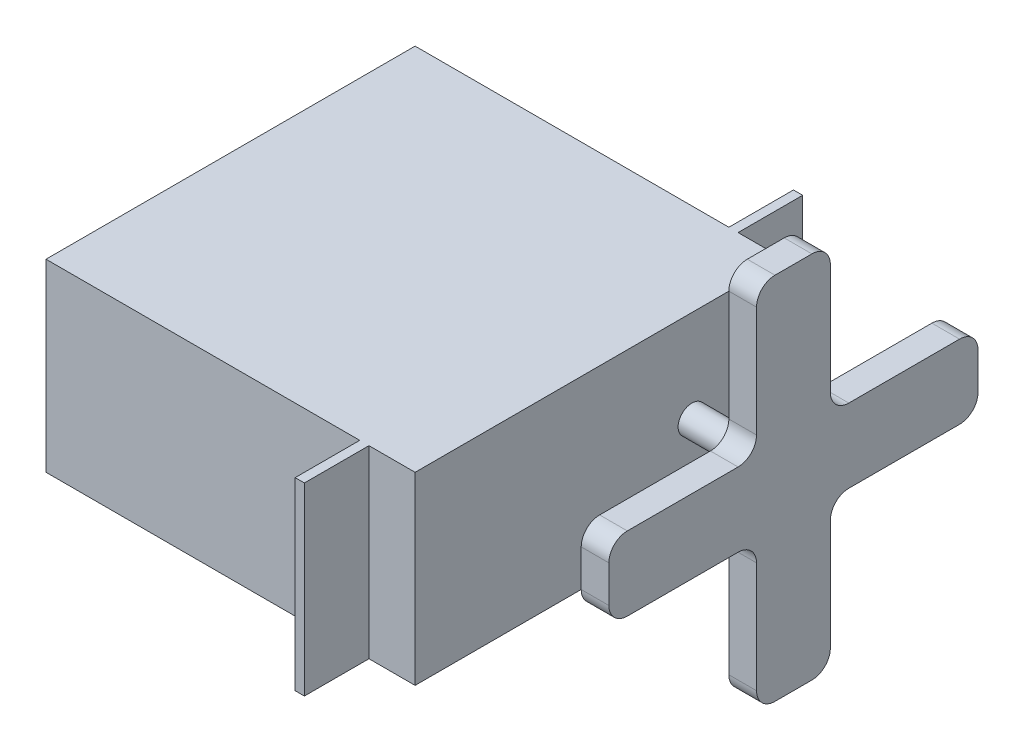
ISO-10303-21;
HEADER;
FILE_DESCRIPTION(('STEP AP214'),'2;1');
FILE_NAME('part.step','',(''),(''),'','','');
FILE_SCHEMA(('AUTOMOTIVE_DESIGN { 1 0 10303 214 1 1 1 1 }'));
ENDSEC;
DATA;
#1=APPLICATION_CONTEXT('core data for automotive mechanical design processes');
#2=APPLICATION_PROTOCOL_DEFINITION('international standard','automotive_design',2000,#1);
#3=PRODUCT_CONTEXT('',#1,'mechanical');
#4=PRODUCT('Part','Part','',(#3));
#5=PRODUCT_RELATED_PRODUCT_CATEGORY('part','',(#4));
#6=PRODUCT_DEFINITION_FORMATION('','',#4);
#7=PRODUCT_DEFINITION_CONTEXT('part definition',#1,'design');
#8=PRODUCT_DEFINITION('design','',#6,#7);
#9=PRODUCT_DEFINITION_SHAPE('','',#8);
#10=(LENGTH_UNIT() NAMED_UNIT(*) SI_UNIT(.MILLI.,.METRE.));
#11=(NAMED_UNIT(*) PLANE_ANGLE_UNIT() SI_UNIT($,.RADIAN.));
#12=(NAMED_UNIT(*) SI_UNIT($,.STERADIAN.) SOLID_ANGLE_UNIT());
#13=UNCERTAINTY_MEASURE_WITH_UNIT(LENGTH_MEASURE(1.E-05),#10,'distance_accuracy_value','');
#14=(GEOMETRIC_REPRESENTATION_CONTEXT(3) GLOBAL_UNCERTAINTY_ASSIGNED_CONTEXT((#13)) GLOBAL_UNIT_ASSIGNED_CONTEXT((#10,
#11,#12)) REPRESENTATION_CONTEXT('',''));
#15=CARTESIAN_POINT('',(0.,0.,0.));
#16=DIRECTION('',(0.,0.,1.));
#17=DIRECTION('',(1.,0.,0.));
#18=AXIS2_PLACEMENT_3D('',#15,#16,#17);
#19=CARTESIAN_POINT('',(0.,0.,0.));
#20=DIRECTION('',(0.,0.,-1.));
#21=DIRECTION('',(-1.,0.,0.));
#22=AXIS2_PLACEMENT_3D('',#19,#20,#21);
#23=PLANE('',#22);
#24=DIRECTION('',(-1.,0.,0.));
#25=VECTOR('',#24,1.);
#26=CARTESIAN_POINT('',(0.,20.,0.));
#27=LINE('',#26,#25);
#28=CARTESIAN_POINT('',(34.,20.,0.));
#29=VERTEX_POINT('',#28);
#30=CARTESIAN_POINT('',(0.,20.,0.));
#31=VERTEX_POINT('',#30);
#32=EDGE_CURVE('E79',#29,#31,#27,.T.);
#33=ORIENTED_EDGE('',*,*,#32,.F.);
#34=DIRECTION('',(0.,-1.,0.));
#35=VECTOR('',#34,1.);
#36=CARTESIAN_POINT('',(34.,20.,0.));
#37=LINE('',#36,#35);
#38=CARTESIAN_POINT('',(34.,0.,0.));
#39=VERTEX_POINT('',#38);
#40=EDGE_CURVE('E74',#29,#39,#37,.T.);
#41=ORIENTED_EDGE('',*,*,#40,.T.);
#42=DIRECTION('',(1.,0.,0.));
#43=VECTOR('',#42,1.);
#44=CARTESIAN_POINT('',(0.,0.,0.));
#45=LINE('',#44,#43);
#46=CARTESIAN_POINT('',(0.,0.,0.));
#47=VERTEX_POINT('',#46);
#48=EDGE_CURVE('E300',#47,#39,#45,.T.);
#49=ORIENTED_EDGE('',*,*,#48,.F.);
#50=DIRECTION('',(0.,-1.,0.));
#51=VECTOR('',#50,1.);
#52=CARTESIAN_POINT('',(0.,0.,0.));
#53=LINE('',#52,#51);
#54=EDGE_CURVE('E301',#31,#47,#53,.T.);
#55=ORIENTED_EDGE('',*,*,#54,.F.);
#56=EDGE_LOOP('',(#33,#41,#49,#55));
#57=FACE_BOUND('',#56,.T.);
#58=ADVANCED_FACE('F57',(#57),#23,.T.);
#59=CARTESIAN_POINT('',(0.,0.,40.));
#60=DIRECTION('',(0.,0.,-1.));
#61=DIRECTION('',(-1.,0.,0.));
#62=AXIS2_PLACEMENT_3D('',#59,#60,#61);
#63=PLANE('',#62);
#64=DIRECTION('',(0.,1.,0.));
#65=VECTOR('',#64,1.);
#66=CARTESIAN_POINT('',(35.,20.,40.));
#67=LINE('',#66,#65);
#68=CARTESIAN_POINT('',(35.,0.,40.));
#69=VERTEX_POINT('',#68);
#70=CARTESIAN_POINT('',(35.,20.,40.));
#71=VERTEX_POINT('',#70);
#72=EDGE_CURVE('E1022',#69,#71,#67,.T.);
#73=ORIENTED_EDGE('',*,*,#72,.F.);
#74=DIRECTION('',(1.,0.,0.));
#75=VECTOR('',#74,1.);
#76=CARTESIAN_POINT('',(0.,0.,40.));
#77=LINE('',#76,#75);
#78=CARTESIAN_POINT('',(40.,0.,40.));
#79=VERTEX_POINT('',#78);
#80=EDGE_CURVE('E815',#69,#79,#77,.T.);
#81=ORIENTED_EDGE('',*,*,#80,.T.);
#82=DIRECTION('',(0.,1.,0.));
#83=VECTOR('',#82,1.);
#84=CARTESIAN_POINT('',(40.,0.,40.));
#85=LINE('',#84,#83);
#86=CARTESIAN_POINT('',(40.,20.,40.));
#87=VERTEX_POINT('',#86);
#88=EDGE_CURVE('E814',#79,#87,#85,.T.);
#89=ORIENTED_EDGE('',*,*,#88,.T.);
#90=DIRECTION('',(-1.,0.,0.));
#91=VECTOR('',#90,1.);
#92=CARTESIAN_POINT('',(0.,20.,40.));
#93=LINE('',#92,#91);
#94=EDGE_CURVE('E831',#87,#71,#93,.T.);
#95=ORIENTED_EDGE('',*,*,#94,.T.);
#96=EDGE_LOOP('',(#73,#81,#89,#95));
#97=FACE_BOUND('',#96,.T.);
#98=ADVANCED_FACE('F355',(#97),#63,.F.);
#99=CARTESIAN_POINT('',(40.,0.,40.));
#100=DIRECTION('',(-1.,0.,0.));
#101=DIRECTION('',(0.,0.,1.));
#102=AXIS2_PLACEMENT_3D('',#99,#100,#101);
#103=PLANE('',#102);
#104=DIRECTION('',(0.,1.,0.));
#105=VECTOR('',#104,1.);
#106=CARTESIAN_POINT('',(40.,0.,0.));
#107=LINE('',#106,#105);
#108=CARTESIAN_POINT('',(40.,0.,0.));
#109=VERTEX_POINT('',#108);
#110=CARTESIAN_POINT('',(40.,20.,0.));
#111=VERTEX_POINT('',#110);
#112=EDGE_CURVE('E296',#109,#111,#107,.T.);
#113=ORIENTED_EDGE('',*,*,#112,.T.);
#114=DIRECTION('',(0.,0.,-1.));
#115=VECTOR('',#114,1.);
#116=CARTESIAN_POINT('',(40.,20.,40.));
#117=LINE('',#116,#115);
#118=EDGE_CURVE('E836',#87,#111,#117,.T.);
#119=ORIENTED_EDGE('',*,*,#118,.F.);
#120=ORIENTED_EDGE('',*,*,#88,.F.);
#121=DIRECTION('',(0.,0.,-1.));
#122=VECTOR('',#121,1.);
#123=CARTESIAN_POINT('',(40.,0.,40.));
#124=LINE('',#123,#122);
#125=EDGE_CURVE('E864',#79,#109,#124,.T.);
#126=ORIENTED_EDGE('',*,*,#125,.T.);
#127=EDGE_LOOP('',(#113,#119,#120,#126));
#128=FACE_BOUND('',#127,.T.);
#129=CARTESIAN_POINT('',(40.,10.,10.));
#130=DIRECTION('',(-1.,0.,0.));
#131=DIRECTION('',(0.,0.,1.));
#132=AXIS2_PLACEMENT_3D('',#129,#130,#131);
#133=CIRCLE('',#132,1.5);
#134=CARTESIAN_POINT('',(40.,10.,11.5));
#135=VERTEX_POINT('',#134);
#136=EDGE_CURVE('E867',#135,#135,#133,.F.);
#137=ORIENTED_EDGE('',*,*,#136,.F.);
#138=EDGE_LOOP('',(#137));
#139=FACE_BOUND('',#138,.T.);
#140=ADVANCED_FACE('F361',(#128,#139),#103,.F.);
#141=CARTESIAN_POINT('',(0.,0.,40.));
#142=DIRECTION('',(1.,0.,0.));
#143=DIRECTION('',(0.,0.,-1.));
#144=AXIS2_PLACEMENT_3D('',#141,#142,#143);
#145=PLANE('',#144);
#146=ORIENTED_EDGE('',*,*,#54,.T.);
#147=DIRECTION('',(0.,0.,-1.));
#148=VECTOR('',#147,1.);
#149=CARTESIAN_POINT('',(0.,0.,40.));
#150=LINE('',#149,#148);
#151=CARTESIAN_POINT('',(0.,0.,40.));
#152=VERTEX_POINT('',#151);
#153=EDGE_CURVE('E849',#152,#47,#150,.T.);
#154=ORIENTED_EDGE('',*,*,#153,.F.);
#155=DIRECTION('',(0.,-1.,0.));
#156=VECTOR('',#155,1.);
#157=CARTESIAN_POINT('',(0.,0.,40.));
#158=LINE('',#157,#156);
#159=CARTESIAN_POINT('',(0.,20.,40.));
#160=VERTEX_POINT('',#159);
#161=EDGE_CURVE('E820',#160,#152,#158,.T.);
#162=ORIENTED_EDGE('',*,*,#161,.F.);
#163=DIRECTION('',(0.,0.,-1.));
#164=VECTOR('',#163,1.);
#165=CARTESIAN_POINT('',(0.,20.,40.));
#166=LINE('',#165,#164);
#167=EDGE_CURVE('E832',#160,#31,#166,.T.);
#168=ORIENTED_EDGE('',*,*,#167,.T.);
#169=EDGE_LOOP('',(#146,#154,#162,#168));
#170=FACE_BOUND('',#169,.T.);
#171=ADVANCED_FACE('F482',(#170),#145,.F.);
#172=CARTESIAN_POINT('',(0.,0.,40.));
#173=DIRECTION('',(0.,1.,0.));
#174=DIRECTION('',(0.,0.,1.));
#175=AXIS2_PLACEMENT_3D('',#172,#173,#174);
#176=PLANE('',#175);
#177=ORIENTED_EDGE('',*,*,#48,.T.);
#178=DIRECTION('',(0.,0.,-1.));
#179=VECTOR('',#178,1.);
#180=CARTESIAN_POINT('',(34.,0.,0.));
#181=LINE('',#180,#179);
#182=CARTESIAN_POINT('',(34.,0.,-7.));
#183=VERTEX_POINT('',#182);
#184=EDGE_CURVE('E333',#39,#183,#181,.T.);
#185=ORIENTED_EDGE('',*,*,#184,.T.);
#186=DIRECTION('',(-1.,0.,0.));
#187=VECTOR('',#186,1.);
#188=CARTESIAN_POINT('',(35.,0.,-7.));
#189=LINE('',#188,#187);
#190=CARTESIAN_POINT('',(35.,0.,-7.));
#191=VERTEX_POINT('',#190);
#192=EDGE_CURVE('E307',#191,#183,#189,.T.);
#193=ORIENTED_EDGE('',*,*,#192,.F.);
#194=DIRECTION('',(0.,0.,-1.));
#195=VECTOR('',#194,1.);
#196=CARTESIAN_POINT('',(35.,0.,0.));
#197=LINE('',#196,#195);
#198=CARTESIAN_POINT('',(35.,0.,0.));
#199=VERTEX_POINT('',#198);
#200=EDGE_CURVE('E304',#199,#191,#197,.T.);
#201=ORIENTED_EDGE('',*,*,#200,.F.);
#202=EDGE_CURVE('E289',#199,#109,#45,.T.);
#203=ORIENTED_EDGE('',*,*,#202,.T.);
#204=ORIENTED_EDGE('',*,*,#125,.F.);
#205=ORIENTED_EDGE('',*,*,#80,.F.);
#206=DIRECTION('',(0.,0.,-1.));
#207=VECTOR('',#206,1.);
#208=CARTESIAN_POINT('',(35.,0.,40.));
#209=LINE('',#208,#207);
#210=CARTESIAN_POINT('',(35.,0.,47.));
#211=VERTEX_POINT('',#210);
#212=EDGE_CURVE('E1037',#211,#69,#209,.T.);
#213=ORIENTED_EDGE('',*,*,#212,.F.);
#214=DIRECTION('',(-1.,0.,0.));
#215=VECTOR('',#214,1.);
#216=CARTESIAN_POINT('',(35.,0.,47.));
#217=LINE('',#216,#215);
#218=CARTESIAN_POINT('',(34.,0.,47.));
#219=VERTEX_POINT('',#218);
#220=EDGE_CURVE('E1020',#211,#219,#217,.T.);
#221=ORIENTED_EDGE('',*,*,#220,.T.);
#222=DIRECTION('',(0.,0.,-1.));
#223=VECTOR('',#222,1.);
#224=CARTESIAN_POINT('',(34.,0.,40.));
#225=LINE('',#224,#223);
#226=CARTESIAN_POINT('',(34.,0.,40.));
#227=VERTEX_POINT('',#226);
#228=EDGE_CURVE('E1017',#219,#227,#225,.T.);
#229=ORIENTED_EDGE('',*,*,#228,.T.);
#230=EDGE_CURVE('E811',#152,#227,#77,.T.);
#231=ORIENTED_EDGE('',*,*,#230,.F.);
#232=ORIENTED_EDGE('',*,*,#153,.T.);
#233=EDGE_LOOP('',(#177,#185,#193,#201,#203,#204,#205,#213,#221,#229,#231,#232));
#234=FACE_BOUND('',#233,.T.);
#235=ADVANCED_FACE('F305',(#234),#176,.F.);
#236=CARTESIAN_POINT('',(0.,20.,40.));
#237=DIRECTION('',(0.,-1.,0.));
#238=DIRECTION('',(0.,0.,-1.));
#239=AXIS2_PLACEMENT_3D('',#236,#237,#238);
#240=PLANE('',#239);
#241=CARTESIAN_POINT('',(35.,20.,0.));
#242=VERTEX_POINT('',#241);
#243=EDGE_CURVE('E850',#111,#242,#27,.T.);
#244=ORIENTED_EDGE('',*,*,#243,.T.);
#245=DIRECTION('',(0.,0.,1.));
#246=VECTOR('',#245,1.);
#247=CARTESIAN_POINT('',(35.,20.,0.));
#248=LINE('',#247,#246);
#249=CARTESIAN_POINT('',(35.,20.,-7.));
#250=VERTEX_POINT('',#249);
#251=EDGE_CURVE('E315',#250,#242,#248,.T.);
#252=ORIENTED_EDGE('',*,*,#251,.F.);
#253=DIRECTION('',(-1.,0.,0.));
#254=VECTOR('',#253,1.);
#255=CARTESIAN_POINT('',(35.,20.,-7.));
#256=LINE('',#255,#254);
#257=CARTESIAN_POINT('',(34.,20.,-7.));
#258=VERTEX_POINT('',#257);
#259=EDGE_CURVE('E341',#250,#258,#256,.T.);
#260=ORIENTED_EDGE('',*,*,#259,.T.);
#261=DIRECTION('',(0.,0.,1.));
#262=VECTOR('',#261,1.);
#263=CARTESIAN_POINT('',(34.,20.,0.));
#264=LINE('',#263,#262);
#265=EDGE_CURVE('E316',#258,#29,#264,.T.);
#266=ORIENTED_EDGE('',*,*,#265,.T.);
#267=ORIENTED_EDGE('',*,*,#32,.T.);
#268=ORIENTED_EDGE('',*,*,#167,.F.);
#269=CARTESIAN_POINT('',(34.,20.,40.));
#270=VERTEX_POINT('',#269);
#271=EDGE_CURVE('E824',#270,#160,#93,.T.);
#272=ORIENTED_EDGE('',*,*,#271,.F.);
#273=DIRECTION('',(0.,0.,1.));
#274=VECTOR('',#273,1.);
#275=CARTESIAN_POINT('',(34.,20.,40.));
#276=LINE('',#275,#274);
#277=CARTESIAN_POINT('',(34.,20.,47.));
#278=VERTEX_POINT('',#277);
#279=EDGE_CURVE('E1025',#270,#278,#276,.T.);
#280=ORIENTED_EDGE('',*,*,#279,.T.);
#281=DIRECTION('',(-1.,0.,0.));
#282=VECTOR('',#281,1.);
#283=CARTESIAN_POINT('',(35.,20.,47.));
#284=LINE('',#283,#282);
#285=CARTESIAN_POINT('',(35.,20.,47.));
#286=VERTEX_POINT('',#285);
#287=EDGE_CURVE('E955',#286,#278,#284,.T.);
#288=ORIENTED_EDGE('',*,*,#287,.F.);
#289=DIRECTION('',(0.,0.,1.));
#290=VECTOR('',#289,1.);
#291=CARTESIAN_POINT('',(35.,20.,40.));
#292=LINE('',#291,#290);
#293=EDGE_CURVE('E1041',#71,#286,#292,.T.);
#294=ORIENTED_EDGE('',*,*,#293,.F.);
#295=ORIENTED_EDGE('',*,*,#94,.F.);
#296=ORIENTED_EDGE('',*,*,#118,.T.);
#297=EDGE_LOOP('',(#244,#252,#260,#266,#267,#268,#272,#280,#288,#294,#295,#296));
#298=FACE_BOUND('',#297,.T.);
#299=ADVANCED_FACE('F345',(#298),#240,.F.);
#300=ORIENTED_EDGE('',*,*,#230,.T.);
#301=DIRECTION('',(0.,1.,0.));
#302=VECTOR('',#301,1.);
#303=CARTESIAN_POINT('',(34.,20.,40.));
#304=LINE('',#303,#302);
#305=EDGE_CURVE('E844',#227,#270,#304,.T.);
#306=ORIENTED_EDGE('',*,*,#305,.T.);
#307=ORIENTED_EDGE('',*,*,#271,.T.);
#308=ORIENTED_EDGE('',*,*,#161,.T.);
#309=EDGE_LOOP('',(#300,#306,#307,#308));
#310=FACE_BOUND('',#309,.T.);
#311=ADVANCED_FACE('F364',(#310),#63,.F.);
#312=DIRECTION('',(0.,-1.,0.));
#313=VECTOR('',#312,1.);
#314=CARTESIAN_POINT('',(35.,20.,0.));
#315=LINE('',#314,#313);
#316=EDGE_CURVE('E294',#242,#199,#315,.T.);
#317=ORIENTED_EDGE('',*,*,#316,.F.);
#318=ORIENTED_EDGE('',*,*,#243,.F.);
#319=ORIENTED_EDGE('',*,*,#112,.F.);
#320=ORIENTED_EDGE('',*,*,#202,.F.);
#321=EDGE_LOOP('',(#317,#318,#319,#320));
#322=FACE_BOUND('',#321,.T.);
#323=ADVANCED_FACE('F291',(#322),#23,.T.);
#324=CARTESIAN_POINT('',(48.,10.,10.));
#325=DIRECTION('',(-1.,0.,0.));
#326=DIRECTION('',(0.,0.,1.));
#327=AXIS2_PLACEMENT_3D('',#324,#325,#326);
#328=CYLINDRICAL_SURFACE('',#327,1.5);
#329=CARTESIAN_POINT('',(48.,10.,10.));
#330=DIRECTION('',(1.,0.,0.));
#331=DIRECTION('',(0.,0.,-1.));
#332=AXIS2_PLACEMENT_3D('',#329,#330,#331);
#333=CIRCLE('',#332,1.5);
#334=CARTESIAN_POINT('',(48.,10.,8.5));
#335=VERTEX_POINT('',#334);
#336=EDGE_CURVE('E962',#335,#335,#333,.T.);
#337=ORIENTED_EDGE('',*,*,#336,.F.);
#338=EDGE_LOOP('',(#337));
#339=FACE_BOUND('',#338,.T.);
#340=ORIENTED_EDGE('',*,*,#136,.T.);
#341=EDGE_LOOP('',(#340));
#342=FACE_BOUND('',#341,.T.);
#343=ADVANCED_FACE('F367',(#339,#342),#328,.T.);
#344=CARTESIAN_POINT('',(48.,0.,0.));
#345=DIRECTION('',(-1.,0.,0.));
#346=DIRECTION('',(0.,0.,1.));
#347=AXIS2_PLACEMENT_3D('',#344,#345,#346);
#348=PLANE('',#347);
#349=DIRECTION('',(0.,0.,-1.));
#350=VECTOR('',#349,1.);
#351=CARTESIAN_POINT('',(48.,30.,14.));
#352=LINE('',#351,#350);
#353=CARTESIAN_POINT('',(48.,30.,12.));
#354=VERTEX_POINT('',#353);
#355=CARTESIAN_POINT('',(48.,30.,8.));
#356=VERTEX_POINT('',#355);
#357=EDGE_CURVE('E958',#354,#356,#352,.T.);
#358=ORIENTED_EDGE('',*,*,#357,.T.);
#359=CARTESIAN_POINT('',(48.,28.,8.));
#360=DIRECTION('',(-1.,0.,0.));
#361=DIRECTION('',(0.,0.,1.));
#362=AXIS2_PLACEMENT_3D('',#359,#360,#361);
#363=CIRCLE('',#362,2.);
#364=CARTESIAN_POINT('',(48.,28.,6.));
#365=VERTEX_POINT('',#364);
#366=EDGE_CURVE('E889',#356,#365,#363,.T.);
#367=ORIENTED_EDGE('',*,*,#366,.T.);
#368=DIRECTION('',(0.,1.,0.));
#369=VECTOR('',#368,1.);
#370=CARTESIAN_POINT('',(48.,-9.99999999999999,6.));
#371=LINE('',#370,#369);
#372=CARTESIAN_POINT('',(48.,16.,6.));
#373=VERTEX_POINT('',#372);
#374=EDGE_CURVE('E894',#373,#365,#371,.T.);
#375=ORIENTED_EDGE('',*,*,#374,.F.);
#376=CARTESIAN_POINT('',(48.,16.,4.));
#377=DIRECTION('',(-1.,0.,0.));
#378=DIRECTION('',(0.,0.,1.));
#379=AXIS2_PLACEMENT_3D('',#376,#377,#378);
#380=CIRCLE('',#379,2.);
#381=CARTESIAN_POINT('',(48.,14.,4.));
#382=VERTEX_POINT('',#381);
#383=EDGE_CURVE('E800',#373,#382,#380,.F.);
#384=ORIENTED_EDGE('',*,*,#383,.T.);
#385=DIRECTION('',(0.,0.,-1.));
#386=VECTOR('',#385,1.);
#387=CARTESIAN_POINT('',(48.,14.,30.));
#388=LINE('',#387,#386);
#389=CARTESIAN_POINT('',(48.,14.,-8.));
#390=VERTEX_POINT('',#389);
#391=EDGE_CURVE('E911',#382,#390,#388,.T.);
#392=ORIENTED_EDGE('',*,*,#391,.T.);
#393=CARTESIAN_POINT('',(48.,12.,-8.));
#394=DIRECTION('',(-1.,0.,0.));
#395=DIRECTION('',(0.,0.,1.));
#396=AXIS2_PLACEMENT_3D('',#393,#394,#395);
#397=CIRCLE('',#396,2.);
#398=CARTESIAN_POINT('',(48.,12.,-10.));
#399=VERTEX_POINT('',#398);
#400=EDGE_CURVE('E885',#390,#399,#397,.T.);
#401=ORIENTED_EDGE('',*,*,#400,.T.);
#402=DIRECTION('',(0.,1.,0.));
#403=VECTOR('',#402,1.);
#404=CARTESIAN_POINT('',(48.,6.00000000000001,-10.));
#405=LINE('',#404,#403);
#406=CARTESIAN_POINT('',(48.,8.00000000000001,-10.));
#407=VERTEX_POINT('',#406);
#408=EDGE_CURVE('E935',#407,#399,#405,.T.);
#409=ORIENTED_EDGE('',*,*,#408,.F.);
#410=CARTESIAN_POINT('',(48.,8.00000000000001,-8.));
#411=DIRECTION('',(-1.,0.,0.));
#412=DIRECTION('',(0.,0.,1.));
#413=AXIS2_PLACEMENT_3D('',#410,#411,#412);
#414=CIRCLE('',#413,2.);
#415=CARTESIAN_POINT('',(48.,6.00000000000001,-8.));
#416=VERTEX_POINT('',#415);
#417=EDGE_CURVE('E887',#407,#416,#414,.T.);
#418=ORIENTED_EDGE('',*,*,#417,.T.);
#419=DIRECTION('',(0.,0.,-1.));
#420=VECTOR('',#419,1.);
#421=CARTESIAN_POINT('',(48.,6.00000000000001,30.));
#422=LINE('',#421,#420);
#423=CARTESIAN_POINT('',(48.,6.00000000000001,4.));
#424=VERTEX_POINT('',#423);
#425=EDGE_CURVE('E938',#424,#416,#422,.T.);
#426=ORIENTED_EDGE('',*,*,#425,.F.);
#427=CARTESIAN_POINT('',(48.,4.00000000000001,4.));
#428=DIRECTION('',(-1.,0.,0.));
#429=DIRECTION('',(0.,0.,1.));
#430=AXIS2_PLACEMENT_3D('',#427,#428,#429);
#431=CIRCLE('',#430,2.);
#432=CARTESIAN_POINT('',(48.,4.00000000000001,6.));
#433=VERTEX_POINT('',#432);
#434=EDGE_CURVE('E804',#424,#433,#431,.F.);
#435=ORIENTED_EDGE('',*,*,#434,.T.);
#436=CARTESIAN_POINT('',(48.,-7.99999999999999,6.));
#437=VERTEX_POINT('',#436);
#438=EDGE_CURVE('E903',#437,#433,#371,.T.);
#439=ORIENTED_EDGE('',*,*,#438,.F.);
#440=CARTESIAN_POINT('',(48.,-7.99999999999999,8.));
#441=DIRECTION('',(-1.,0.,0.));
#442=DIRECTION('',(0.,0.,1.));
#443=AXIS2_PLACEMENT_3D('',#440,#441,#442);
#444=CIRCLE('',#443,2.);
#445=CARTESIAN_POINT('',(48.,-9.99999999999999,8.));
#446=VERTEX_POINT('',#445);
#447=EDGE_CURVE('E883',#437,#446,#444,.T.);
#448=ORIENTED_EDGE('',*,*,#447,.T.);
#449=DIRECTION('',(0.,0.,-1.));
#450=VECTOR('',#449,1.);
#451=CARTESIAN_POINT('',(48.,-9.99999999999999,14.));
#452=LINE('',#451,#450);
#453=CARTESIAN_POINT('',(48.,-9.99999999999999,12.));
#454=VERTEX_POINT('',#453);
#455=EDGE_CURVE('E904',#454,#446,#452,.T.);
#456=ORIENTED_EDGE('',*,*,#455,.F.);
#457=CARTESIAN_POINT('',(48.,-7.99999999999999,12.));
#458=DIRECTION('',(-1.,0.,0.));
#459=DIRECTION('',(0.,0.,1.));
#460=AXIS2_PLACEMENT_3D('',#457,#458,#459);
#461=CIRCLE('',#460,2.);
#462=CARTESIAN_POINT('',(48.,-7.99999999999999,14.));
#463=VERTEX_POINT('',#462);
#464=EDGE_CURVE('E881',#454,#463,#461,.T.);
#465=ORIENTED_EDGE('',*,*,#464,.T.);
#466=DIRECTION('',(0.,1.,0.));
#467=VECTOR('',#466,1.);
#468=CARTESIAN_POINT('',(48.,-9.99999999999999,14.));
#469=LINE('',#468,#467);
#470=CARTESIAN_POINT('',(48.,4.00000000000001,14.));
#471=VERTEX_POINT('',#470);
#472=EDGE_CURVE('E944',#463,#471,#469,.T.);
#473=ORIENTED_EDGE('',*,*,#472,.T.);
#474=CARTESIAN_POINT('',(48.,4.00000000000001,16.));
#475=DIRECTION('',(-1.,0.,0.));
#476=DIRECTION('',(0.,0.,1.));
#477=AXIS2_PLACEMENT_3D('',#474,#475,#476);
#478=CIRCLE('',#477,2.);
#479=CARTESIAN_POINT('',(48.,6.00000000000001,16.));
#480=VERTEX_POINT('',#479);
#481=EDGE_CURVE('E808',#471,#480,#478,.F.);
#482=ORIENTED_EDGE('',*,*,#481,.T.);
#483=CARTESIAN_POINT('',(48.,6.00000000000001,28.));
#484=VERTEX_POINT('',#483);
#485=EDGE_CURVE('E920',#484,#480,#422,.T.);
#486=ORIENTED_EDGE('',*,*,#485,.F.);
#487=CARTESIAN_POINT('',(48.,8.00000000000001,28.));
#488=DIRECTION('',(-1.,0.,0.));
#489=DIRECTION('',(0.,0.,1.));
#490=AXIS2_PLACEMENT_3D('',#487,#488,#489);
#491=CIRCLE('',#490,2.);
#492=CARTESIAN_POINT('',(48.,8.00000000000001,30.));
#493=VERTEX_POINT('',#492);
#494=EDGE_CURVE('E875',#484,#493,#491,.T.);
#495=ORIENTED_EDGE('',*,*,#494,.T.);
#496=DIRECTION('',(0.,1.,0.));
#497=VECTOR('',#496,1.);
#498=CARTESIAN_POINT('',(48.,6.00000000000001,30.));
#499=LINE('',#498,#497);
#500=CARTESIAN_POINT('',(48.,12.,30.));
#501=VERTEX_POINT('',#500);
#502=EDGE_CURVE('E929',#493,#501,#499,.T.);
#503=ORIENTED_EDGE('',*,*,#502,.T.);
#504=CARTESIAN_POINT('',(48.,12.,28.));
#505=DIRECTION('',(-1.,0.,0.));
#506=DIRECTION('',(0.,0.,1.));
#507=AXIS2_PLACEMENT_3D('',#504,#505,#506);
#508=CIRCLE('',#507,2.);
#509=CARTESIAN_POINT('',(48.,14.,28.));
#510=VERTEX_POINT('',#509);
#511=EDGE_CURVE('E877',#501,#510,#508,.T.);
#512=ORIENTED_EDGE('',*,*,#511,.T.);
#513=CARTESIAN_POINT('',(48.,14.,16.));
#514=VERTEX_POINT('',#513);
#515=EDGE_CURVE('E934',#510,#514,#388,.T.);
#516=ORIENTED_EDGE('',*,*,#515,.T.);
#517=CARTESIAN_POINT('',(48.,16.,16.));
#518=DIRECTION('',(-1.,0.,0.));
#519=DIRECTION('',(0.,0.,1.));
#520=AXIS2_PLACEMENT_3D('',#517,#518,#519);
#521=CIRCLE('',#520,2.);
#522=CARTESIAN_POINT('',(48.,16.,14.));
#523=VERTEX_POINT('',#522);
#524=EDGE_CURVE('E12',#514,#523,#521,.F.);
#525=ORIENTED_EDGE('',*,*,#524,.T.);
#526=CARTESIAN_POINT('',(48.,28.,14.));
#527=VERTEX_POINT('',#526);
#528=EDGE_CURVE('E960',#523,#527,#469,.T.);
#529=ORIENTED_EDGE('',*,*,#528,.T.);
#530=CARTESIAN_POINT('',(48.,28.,12.));
#531=DIRECTION('',(-1.,0.,0.));
#532=DIRECTION('',(0.,0.,1.));
#533=AXIS2_PLACEMENT_3D('',#530,#531,#532);
#534=CIRCLE('',#533,2.);
#535=EDGE_CURVE('E879',#527,#354,#534,.T.);
#536=ORIENTED_EDGE('',*,*,#535,.T.);
#537=EDGE_LOOP('',(#358,#367,#375,#384,#392,#401,#409,#418,#426,#435,#439,#448,#456,#465,#473,
#482,#486,#495,#503,#512,#516,#525,#529,#536));
#538=FACE_BOUND('',#537,.T.);
#539=ORIENTED_EDGE('',*,*,#336,.T.);
#540=EDGE_LOOP('',(#539));
#541=FACE_BOUND('',#540,.T.);
#542=ADVANCED_FACE('F373',(#538,#541),#348,.T.);
#543=CARTESIAN_POINT('',(51.,14.,30.));
#544=DIRECTION('',(0.,1.,0.));
#545=DIRECTION('',(0.,0.,1.));
#546=AXIS2_PLACEMENT_3D('',#543,#544,#545);
#547=PLANE('',#546);
#548=DIRECTION('',(0.,0.,-1.));
#549=VECTOR('',#548,1.);
#550=CARTESIAN_POINT('',(51.,14.,30.));
#551=LINE('',#550,#549);
#552=CARTESIAN_POINT('',(51.,14.,28.));
#553=VERTEX_POINT('',#552);
#554=CARTESIAN_POINT('',(51.,14.,16.));
#555=VERTEX_POINT('',#554);
#556=EDGE_CURVE('E914',#553,#555,#551,.T.);
#557=ORIENTED_EDGE('',*,*,#556,.T.);
#558=DIRECTION('',(1.,0.,0.));
#559=VECTOR('',#558,1.);
#560=CARTESIAN_POINT('',(48.,14.,16.));
#561=LINE('',#560,#559);
#562=EDGE_CURVE('E792',#555,#514,#561,.F.);
#563=ORIENTED_EDGE('',*,*,#562,.T.);
#564=ORIENTED_EDGE('',*,*,#515,.F.);
#565=DIRECTION('',(-1.,0.,0.));
#566=VECTOR('',#565,1.);
#567=CARTESIAN_POINT('',(51.,14.,28.));
#568=LINE('',#567,#566);
#569=EDGE_CURVE('E790',#510,#553,#568,.F.);
#570=ORIENTED_EDGE('',*,*,#569,.T.);
#571=EDGE_LOOP('',(#557,#563,#564,#570));
#572=FACE_BOUND('',#571,.T.);
#573=ADVANCED_FACE('F406',(#572),#547,.T.);
#574=CARTESIAN_POINT('',(51.,6.00000000000001,30.));
#575=DIRECTION('',(0.,0.,1.));
#576=DIRECTION('',(1.,0.,0.));
#577=AXIS2_PLACEMENT_3D('',#574,#575,#576);
#578=PLANE('',#577);
#579=DIRECTION('',(0.,1.,0.));
#580=VECTOR('',#579,1.);
#581=CARTESIAN_POINT('',(51.,6.00000000000001,30.));
#582=LINE('',#581,#580);
#583=CARTESIAN_POINT('',(51.,8.00000000000001,30.));
#584=VERTEX_POINT('',#583);
#585=CARTESIAN_POINT('',(51.,12.,30.));
#586=VERTEX_POINT('',#585);
#587=EDGE_CURVE('E915',#584,#586,#582,.T.);
#588=ORIENTED_EDGE('',*,*,#587,.T.);
#589=DIRECTION('',(-1.,0.,0.));
#590=VECTOR('',#589,1.);
#591=CARTESIAN_POINT('',(51.,12.,30.));
#592=LINE('',#591,#590);
#593=EDGE_CURVE('E795',#586,#501,#592,.T.);
#594=ORIENTED_EDGE('',*,*,#593,.T.);
#595=ORIENTED_EDGE('',*,*,#502,.F.);
#596=DIRECTION('',(-1.,0.,0.));
#597=VECTOR('',#596,1.);
#598=CARTESIAN_POINT('',(51.,8.00000000000001,30.));
#599=LINE('',#598,#597);
#600=EDGE_CURVE('E724',#493,#584,#599,.F.);
#601=ORIENTED_EDGE('',*,*,#600,.T.);
#602=EDGE_LOOP('',(#588,#594,#595,#601));
#603=FACE_BOUND('',#602,.T.);
#604=ADVANCED_FACE('F402',(#603),#578,.T.);
#605=CARTESIAN_POINT('',(51.,6.00000000000001,30.));
#606=DIRECTION('',(0.,1.,0.));
#607=DIRECTION('',(0.,0.,1.));
#608=AXIS2_PLACEMENT_3D('',#605,#606,#607);
#609=PLANE('',#608);
#610=ORIENTED_EDGE('',*,*,#485,.T.);
#611=DIRECTION('',(1.,0.,0.));
#612=VECTOR('',#611,1.);
#613=CARTESIAN_POINT('',(51.,6.00000000000001,16.));
#614=LINE('',#613,#612);
#615=CARTESIAN_POINT('',(51.,6.00000000000001,16.));
#616=VERTEX_POINT('',#615);
#617=EDGE_CURVE('E781',#480,#616,#614,.T.);
#618=ORIENTED_EDGE('',*,*,#617,.T.);
#619=DIRECTION('',(0.,0.,-1.));
#620=VECTOR('',#619,1.);
#621=CARTESIAN_POINT('',(51.,6.00000000000001,30.));
#622=LINE('',#621,#620);
#623=CARTESIAN_POINT('',(51.,6.00000000000001,28.));
#624=VERTEX_POINT('',#623);
#625=EDGE_CURVE('E928',#624,#616,#622,.T.);
#626=ORIENTED_EDGE('',*,*,#625,.F.);
#627=DIRECTION('',(-1.,0.,0.));
#628=VECTOR('',#627,1.);
#629=CARTESIAN_POINT('',(48.,6.00000000000001,28.));
#630=LINE('',#629,#628);
#631=EDGE_CURVE('E726',#624,#484,#630,.T.);
#632=ORIENTED_EDGE('',*,*,#631,.T.);
#633=EDGE_LOOP('',(#610,#618,#626,#632));
#634=FACE_BOUND('',#633,.T.);
#635=ADVANCED_FACE('F405',(#634),#609,.F.);
#636=CARTESIAN_POINT('',(51.,0.,0.));
#637=DIRECTION('',(-1.,0.,0.));
#638=DIRECTION('',(0.,0.,1.));
#639=AXIS2_PLACEMENT_3D('',#636,#637,#638);
#640=PLANE('',#639);
#641=DIRECTION('',(0.,1.,0.));
#642=VECTOR('',#641,1.);
#643=CARTESIAN_POINT('',(51.,-9.99999999999999,6.));
#644=LINE('',#643,#642);
#645=CARTESIAN_POINT('',(51.,16.,6.));
#646=VERTEX_POINT('',#645);
#647=CARTESIAN_POINT('',(51.,28.,6.));
#648=VERTEX_POINT('',#647);
#649=EDGE_CURVE('E897',#646,#648,#644,.T.);
#650=ORIENTED_EDGE('',*,*,#649,.T.);
#651=CARTESIAN_POINT('',(51.,28.,8.));
#652=DIRECTION('',(-1.,0.,0.));
#653=DIRECTION('',(0.,0.,1.));
#654=AXIS2_PLACEMENT_3D('',#651,#652,#653);
#655=CIRCLE('',#654,2.);
#656=CARTESIAN_POINT('',(51.,30.,8.));
#657=VERTEX_POINT('',#656);
#658=EDGE_CURVE('E748',#648,#657,#655,.F.);
#659=ORIENTED_EDGE('',*,*,#658,.T.);
#660=DIRECTION('',(0.,0.,-1.));
#661=VECTOR('',#660,1.);
#662=CARTESIAN_POINT('',(51.,30.,14.));
#663=LINE('',#662,#661);
#664=CARTESIAN_POINT('',(51.,30.,12.));
#665=VERTEX_POINT('',#664);
#666=EDGE_CURVE('E948',#665,#657,#663,.T.);
#667=ORIENTED_EDGE('',*,*,#666,.F.);
#668=CARTESIAN_POINT('',(51.,28.,12.));
#669=DIRECTION('',(-1.,0.,0.));
#670=DIRECTION('',(0.,0.,1.));
#671=AXIS2_PLACEMENT_3D('',#668,#669,#670);
#672=CIRCLE('',#671,2.);
#673=CARTESIAN_POINT('',(51.,28.,14.));
#674=VERTEX_POINT('',#673);
#675=EDGE_CURVE('E733',#665,#674,#672,.F.);
#676=ORIENTED_EDGE('',*,*,#675,.T.);
#677=DIRECTION('',(0.,1.,0.));
#678=VECTOR('',#677,1.);
#679=CARTESIAN_POINT('',(51.,-9.99999999999999,14.));
#680=LINE('',#679,#678);
#681=CARTESIAN_POINT('',(51.,16.,14.));
#682=VERTEX_POINT('',#681);
#683=EDGE_CURVE('E951',#682,#674,#680,.T.);
#684=ORIENTED_EDGE('',*,*,#683,.F.);
#685=CARTESIAN_POINT('',(51.,16.,16.));
#686=DIRECTION('',(-1.,0.,0.));
#687=DIRECTION('',(0.,0.,1.));
#688=AXIS2_PLACEMENT_3D('',#685,#686,#687);
#689=CIRCLE('',#688,2.);
#690=EDGE_CURVE('E66',#682,#555,#689,.T.);
#691=ORIENTED_EDGE('',*,*,#690,.T.);
#692=ORIENTED_EDGE('',*,*,#556,.F.);
#693=CARTESIAN_POINT('',(51.,12.,28.));
#694=DIRECTION('',(-1.,0.,0.));
#695=DIRECTION('',(0.,0.,1.));
#696=AXIS2_PLACEMENT_3D('',#693,#694,#695);
#697=CIRCLE('',#696,2.);
#698=EDGE_CURVE('E730',#553,#586,#697,.F.);
#699=ORIENTED_EDGE('',*,*,#698,.T.);
#700=ORIENTED_EDGE('',*,*,#587,.F.);
#701=CARTESIAN_POINT('',(51.,8.00000000000001,28.));
#702=DIRECTION('',(-1.,0.,0.));
#703=DIRECTION('',(0.,0.,1.));
#704=AXIS2_PLACEMENT_3D('',#701,#702,#703);
#705=CIRCLE('',#704,2.);
#706=EDGE_CURVE('E723',#584,#624,#705,.F.);
#707=ORIENTED_EDGE('',*,*,#706,.T.);
#708=ORIENTED_EDGE('',*,*,#625,.T.);
#709=CARTESIAN_POINT('',(51.,4.00000000000001,16.));
#710=DIRECTION('',(-1.,0.,0.));
#711=DIRECTION('',(0.,0.,1.));
#712=AXIS2_PLACEMENT_3D('',#709,#710,#711);
#713=CIRCLE('',#712,2.);
#714=CARTESIAN_POINT('',(51.,4.00000000000001,14.));
#715=VERTEX_POINT('',#714);
#716=EDGE_CURVE('E806',#616,#715,#713,.T.);
#717=ORIENTED_EDGE('',*,*,#716,.T.);
#718=CARTESIAN_POINT('',(51.,-7.99999999999999,14.));
#719=VERTEX_POINT('',#718);
#720=EDGE_CURVE('E932',#719,#715,#680,.T.);
#721=ORIENTED_EDGE('',*,*,#720,.F.);
#722=CARTESIAN_POINT('',(51.,-7.99999999999999,12.));
#723=DIRECTION('',(-1.,0.,0.));
#724=DIRECTION('',(0.,0.,1.));
#725=AXIS2_PLACEMENT_3D('',#722,#723,#724);
#726=CIRCLE('',#725,2.);
#727=CARTESIAN_POINT('',(51.,-9.99999999999999,12.));
#728=VERTEX_POINT('',#727);
#729=EDGE_CURVE('E740',#719,#728,#726,.F.);
#730=ORIENTED_EDGE('',*,*,#729,.T.);
#731=DIRECTION('',(0.,0.,-1.));
#732=VECTOR('',#731,1.);
#733=CARTESIAN_POINT('',(51.,-9.99999999999999,14.));
#734=LINE('',#733,#732);
#735=CARTESIAN_POINT('',(51.,-9.99999999999999,8.));
#736=VERTEX_POINT('',#735);
#737=EDGE_CURVE('E941',#728,#736,#734,.T.);
#738=ORIENTED_EDGE('',*,*,#737,.T.);
#739=CARTESIAN_POINT('',(51.,-7.99999999999999,8.));
#740=DIRECTION('',(-1.,0.,0.));
#741=DIRECTION('',(0.,0.,1.));
#742=AXIS2_PLACEMENT_3D('',#739,#740,#741);
#743=CIRCLE('',#742,2.);
#744=CARTESIAN_POINT('',(51.,-7.99999999999999,6.));
#745=VERTEX_POINT('',#744);
#746=EDGE_CURVE('E742',#736,#745,#743,.F.);
#747=ORIENTED_EDGE('',*,*,#746,.T.);
#748=CARTESIAN_POINT('',(51.,4.00000000000001,6.));
#749=VERTEX_POINT('',#748);
#750=EDGE_CURVE('E945',#745,#749,#644,.T.);
#751=ORIENTED_EDGE('',*,*,#750,.T.);
#752=CARTESIAN_POINT('',(51.,4.00000000000001,4.));
#753=DIRECTION('',(-1.,0.,0.));
#754=DIRECTION('',(0.,0.,1.));
#755=AXIS2_PLACEMENT_3D('',#752,#753,#754);
#756=CIRCLE('',#755,2.);
#757=CARTESIAN_POINT('',(51.,6.00000000000001,4.));
#758=VERTEX_POINT('',#757);
#759=EDGE_CURVE('E802',#749,#758,#756,.T.);
#760=ORIENTED_EDGE('',*,*,#759,.T.);
#761=CARTESIAN_POINT('',(51.,6.00000000000001,-8.));
#762=VERTEX_POINT('',#761);
#763=EDGE_CURVE('E925',#758,#762,#622,.T.);
#764=ORIENTED_EDGE('',*,*,#763,.T.);
#765=CARTESIAN_POINT('',(51.,8.00000000000001,-8.));
#766=DIRECTION('',(-1.,0.,0.));
#767=DIRECTION('',(0.,0.,1.));
#768=AXIS2_PLACEMENT_3D('',#765,#766,#767);
#769=CIRCLE('',#768,2.);
#770=CARTESIAN_POINT('',(51.,8.00000000000001,-10.));
#771=VERTEX_POINT('',#770);
#772=EDGE_CURVE('E746',#762,#771,#769,.F.);
#773=ORIENTED_EDGE('',*,*,#772,.T.);
#774=DIRECTION('',(0.,1.,0.));
#775=VECTOR('',#774,1.);
#776=CARTESIAN_POINT('',(51.,6.00000000000001,-10.));
#777=LINE('',#776,#775);
#778=CARTESIAN_POINT('',(51.,12.,-10.));
#779=VERTEX_POINT('',#778);
#780=EDGE_CURVE('E918',#771,#779,#777,.T.);
#781=ORIENTED_EDGE('',*,*,#780,.T.);
#782=CARTESIAN_POINT('',(51.,12.,-8.));
#783=DIRECTION('',(-1.,0.,0.));
#784=DIRECTION('',(0.,0.,1.));
#785=AXIS2_PLACEMENT_3D('',#782,#783,#784);
#786=CIRCLE('',#785,2.);
#787=CARTESIAN_POINT('',(51.,14.,-8.));
#788=VERTEX_POINT('',#787);
#789=EDGE_CURVE('E744',#779,#788,#786,.F.);
#790=ORIENTED_EDGE('',*,*,#789,.T.);
#791=CARTESIAN_POINT('',(51.,14.,4.));
#792=VERTEX_POINT('',#791);
#793=EDGE_CURVE('E909',#792,#788,#551,.T.);
#794=ORIENTED_EDGE('',*,*,#793,.F.);
#795=CARTESIAN_POINT('',(51.,16.,4.));
#796=DIRECTION('',(-1.,0.,0.));
#797=DIRECTION('',(0.,0.,1.));
#798=AXIS2_PLACEMENT_3D('',#795,#796,#797);
#799=CIRCLE('',#798,2.);
#800=EDGE_CURVE('E798',#792,#646,#799,.T.);
#801=ORIENTED_EDGE('',*,*,#800,.T.);
#802=EDGE_LOOP('',(#650,#659,#667,#676,#684,#691,#692,#699,#700,#707,#708,#717,#721,#730,#738,
#747,#751,#760,#764,#773,#781,#790,#794,#801));
#803=FACE_BOUND('',#802,.T.);
#804=ADVANCED_FACE('F415',(#803),#640,.F.);
#805=CARTESIAN_POINT('',(51.,6.00000000000001,-10.));
#806=DIRECTION('',(0.,0.,1.));
#807=DIRECTION('',(1.,0.,0.));
#808=AXIS2_PLACEMENT_3D('',#805,#806,#807);
#809=PLANE('',#808);
#810=ORIENTED_EDGE('',*,*,#780,.F.);
#811=DIRECTION('',(-1.,0.,0.));
#812=VECTOR('',#811,1.);
#813=CARTESIAN_POINT('',(51.,8.00000000000001,-10.));
#814=LINE('',#813,#812);
#815=EDGE_CURVE('E758',#771,#407,#814,.T.);
#816=ORIENTED_EDGE('',*,*,#815,.T.);
#817=ORIENTED_EDGE('',*,*,#408,.T.);
#818=DIRECTION('',(-1.,0.,0.));
#819=VECTOR('',#818,1.);
#820=CARTESIAN_POINT('',(51.,12.,-10.));
#821=LINE('',#820,#819);
#822=EDGE_CURVE('E756',#399,#779,#821,.F.);
#823=ORIENTED_EDGE('',*,*,#822,.T.);
#824=EDGE_LOOP('',(#810,#816,#817,#823));
#825=FACE_BOUND('',#824,.T.);
#826=ADVANCED_FACE('F412',(#825),#809,.F.);
#827=ORIENTED_EDGE('',*,*,#391,.F.);
#828=DIRECTION('',(1.,0.,0.));
#829=VECTOR('',#828,1.);
#830=CARTESIAN_POINT('',(51.,14.,4.));
#831=LINE('',#830,#829);
#832=EDGE_CURVE('E753',#382,#792,#831,.T.);
#833=ORIENTED_EDGE('',*,*,#832,.T.);
#834=ORIENTED_EDGE('',*,*,#793,.T.);
#835=DIRECTION('',(-1.,0.,0.));
#836=VECTOR('',#835,1.);
#837=CARTESIAN_POINT('',(48.,14.,-8.));
#838=LINE('',#837,#836);
#839=EDGE_CURVE('E750',#788,#390,#838,.T.);
#840=ORIENTED_EDGE('',*,*,#839,.T.);
#841=EDGE_LOOP('',(#827,#833,#834,#840));
#842=FACE_BOUND('',#841,.T.);
#843=ADVANCED_FACE('F411',(#842),#547,.T.);
#844=ORIENTED_EDGE('',*,*,#425,.T.);
#845=DIRECTION('',(-1.,0.,0.));
#846=VECTOR('',#845,1.);
#847=CARTESIAN_POINT('',(51.,6.00000000000001,-8.));
#848=LINE('',#847,#846);
#849=EDGE_CURVE('E763',#416,#762,#848,.F.);
#850=ORIENTED_EDGE('',*,*,#849,.T.);
#851=ORIENTED_EDGE('',*,*,#763,.F.);
#852=DIRECTION('',(1.,0.,0.));
#853=VECTOR('',#852,1.);
#854=CARTESIAN_POINT('',(48.,6.00000000000001,4.));
#855=LINE('',#854,#853);
#856=EDGE_CURVE('E761',#758,#424,#855,.F.);
#857=ORIENTED_EDGE('',*,*,#856,.T.);
#858=EDGE_LOOP('',(#844,#850,#851,#857));
#859=FACE_BOUND('',#858,.T.);
#860=ADVANCED_FACE('F394',(#859),#609,.F.);
#861=CARTESIAN_POINT('',(51.,-9.99999999999999,6.));
#862=DIRECTION('',(0.,0.,1.));
#863=DIRECTION('',(1.,0.,0.));
#864=AXIS2_PLACEMENT_3D('',#861,#862,#863);
#865=PLANE('',#864);
#866=ORIENTED_EDGE('',*,*,#374,.T.);
#867=DIRECTION('',(-1.,0.,0.));
#868=VECTOR('',#867,1.);
#869=CARTESIAN_POINT('',(51.,28.,6.));
#870=LINE('',#869,#868);
#871=EDGE_CURVE('E731',#365,#648,#870,.F.);
#872=ORIENTED_EDGE('',*,*,#871,.T.);
#873=ORIENTED_EDGE('',*,*,#649,.F.);
#874=DIRECTION('',(1.,0.,0.));
#875=VECTOR('',#874,1.);
#876=CARTESIAN_POINT('',(51.,16.,6.));
#877=LINE('',#876,#875);
#878=EDGE_CURVE('E735',#646,#373,#877,.F.);
#879=ORIENTED_EDGE('',*,*,#878,.T.);
#880=EDGE_LOOP('',(#866,#872,#873,#879));
#881=FACE_BOUND('',#880,.T.);
#882=ADVANCED_FACE('F390',(#881),#865,.F.);
#883=CARTESIAN_POINT('',(51.,30.,14.));
#884=DIRECTION('',(0.,1.,0.));
#885=DIRECTION('',(0.,0.,1.));
#886=AXIS2_PLACEMENT_3D('',#883,#884,#885);
#887=PLANE('',#886);
#888=ORIENTED_EDGE('',*,*,#666,.T.);
#889=DIRECTION('',(-1.,0.,0.));
#890=VECTOR('',#889,1.);
#891=CARTESIAN_POINT('',(48.,30.,8.));
#892=LINE('',#891,#890);
#893=EDGE_CURVE('E872',#657,#356,#892,.T.);
#894=ORIENTED_EDGE('',*,*,#893,.T.);
#895=ORIENTED_EDGE('',*,*,#357,.F.);
#896=DIRECTION('',(-1.,0.,0.));
#897=VECTOR('',#896,1.);
#898=CARTESIAN_POINT('',(51.,30.,12.));
#899=LINE('',#898,#897);
#900=EDGE_CURVE('E870',#354,#665,#899,.F.);
#901=ORIENTED_EDGE('',*,*,#900,.T.);
#902=EDGE_LOOP('',(#888,#894,#895,#901));
#903=FACE_BOUND('',#902,.T.);
#904=ADVANCED_FACE('F393',(#903),#887,.T.);
#905=CARTESIAN_POINT('',(51.,-9.99999999999999,14.));
#906=DIRECTION('',(0.,0.,1.));
#907=DIRECTION('',(1.,0.,0.));
#908=AXIS2_PLACEMENT_3D('',#905,#906,#907);
#909=PLANE('',#908);
#910=ORIENTED_EDGE('',*,*,#683,.T.);
#911=DIRECTION('',(-1.,0.,0.));
#912=VECTOR('',#911,1.);
#913=CARTESIAN_POINT('',(51.,28.,14.));
#914=LINE('',#913,#912);
#915=EDGE_CURVE('E787',#674,#527,#914,.T.);
#916=ORIENTED_EDGE('',*,*,#915,.T.);
#917=ORIENTED_EDGE('',*,*,#528,.F.);
#918=DIRECTION('',(1.,0.,0.));
#919=VECTOR('',#918,1.);
#920=CARTESIAN_POINT('',(51.,16.,14.));
#921=LINE('',#920,#919);
#922=EDGE_CURVE('E784',#523,#682,#921,.T.);
#923=ORIENTED_EDGE('',*,*,#922,.T.);
#924=EDGE_LOOP('',(#910,#916,#917,#923));
#925=FACE_BOUND('',#924,.T.);
#926=ADVANCED_FACE('F386',(#925),#909,.T.);
#927=CARTESIAN_POINT('',(51.,-9.99999999999999,14.));
#928=DIRECTION('',(0.,1.,0.));
#929=DIRECTION('',(0.,0.,1.));
#930=AXIS2_PLACEMENT_3D('',#927,#928,#929);
#931=PLANE('',#930);
#932=ORIENTED_EDGE('',*,*,#455,.T.);
#933=DIRECTION('',(-1.,0.,0.));
#934=VECTOR('',#933,1.);
#935=CARTESIAN_POINT('',(51.,-9.99999999999999,8.));
#936=LINE('',#935,#934);
#937=EDGE_CURVE('E774',#446,#736,#936,.F.);
#938=ORIENTED_EDGE('',*,*,#937,.T.);
#939=ORIENTED_EDGE('',*,*,#737,.F.);
#940=DIRECTION('',(-1.,0.,0.));
#941=VECTOR('',#940,1.);
#942=CARTESIAN_POINT('',(48.,-9.99999999999999,12.));
#943=LINE('',#942,#941);
#944=EDGE_CURVE('E771',#728,#454,#943,.T.);
#945=ORIENTED_EDGE('',*,*,#944,.T.);
#946=EDGE_LOOP('',(#932,#938,#939,#945));
#947=FACE_BOUND('',#946,.T.);
#948=ADVANCED_FACE('F382',(#947),#931,.F.);
#949=ORIENTED_EDGE('',*,*,#438,.T.);
#950=DIRECTION('',(1.,0.,0.));
#951=VECTOR('',#950,1.);
#952=CARTESIAN_POINT('',(51.,4.00000000000001,6.));
#953=LINE('',#952,#951);
#954=EDGE_CURVE('E768',#433,#749,#953,.T.);
#955=ORIENTED_EDGE('',*,*,#954,.T.);
#956=ORIENTED_EDGE('',*,*,#750,.F.);
#957=DIRECTION('',(-1.,0.,0.));
#958=VECTOR('',#957,1.);
#959=CARTESIAN_POINT('',(51.,-7.99999999999999,6.));
#960=LINE('',#959,#958);
#961=EDGE_CURVE('E765',#745,#437,#960,.T.);
#962=ORIENTED_EDGE('',*,*,#961,.T.);
#963=EDGE_LOOP('',(#949,#955,#956,#962));
#964=FACE_BOUND('',#963,.T.);
#965=ADVANCED_FACE('F385',(#964),#865,.F.);
#966=ORIENTED_EDGE('',*,*,#472,.F.);
#967=DIRECTION('',(-1.,0.,0.));
#968=VECTOR('',#967,1.);
#969=CARTESIAN_POINT('',(51.,-7.99999999999999,14.));
#970=LINE('',#969,#968);
#971=EDGE_CURVE('E778',#463,#719,#970,.F.);
#972=ORIENTED_EDGE('',*,*,#971,.T.);
#973=ORIENTED_EDGE('',*,*,#720,.T.);
#974=DIRECTION('',(1.,0.,0.));
#975=VECTOR('',#974,1.);
#976=CARTESIAN_POINT('',(51.,4.00000000000001,14.));
#977=LINE('',#976,#975);
#978=EDGE_CURVE('E776',#715,#471,#977,.F.);
#979=ORIENTED_EDGE('',*,*,#978,.T.);
#980=EDGE_LOOP('',(#966,#972,#973,#979));
#981=FACE_BOUND('',#980,.T.);
#982=ADVANCED_FACE('F389',(#981),#909,.T.);
#983=CARTESIAN_POINT('',(51.,28.,8.));
#984=DIRECTION('',(1.,0.,0.));
#985=DIRECTION('',(0.,0.,-1.));
#986=AXIS2_PLACEMENT_3D('',#983,#984,#985);
#987=CYLINDRICAL_SURFACE('',#986,2.);
#988=ORIENTED_EDGE('',*,*,#658,.F.);
#989=ORIENTED_EDGE('',*,*,#871,.F.);
#990=ORIENTED_EDGE('',*,*,#366,.F.);
#991=ORIENTED_EDGE('',*,*,#893,.F.);
#992=EDGE_LOOP('',(#988,#989,#990,#991));
#993=FACE_BOUND('',#992,.T.);
#994=ADVANCED_FACE('F388',(#993),#987,.T.);
#995=CARTESIAN_POINT('',(51.,16.,4.));
#996=DIRECTION('',(1.,0.,0.));
#997=DIRECTION('',(0.,0.,-1.));
#998=AXIS2_PLACEMENT_3D('',#995,#996,#997);
#999=CYLINDRICAL_SURFACE('',#998,2.);
#1000=ORIENTED_EDGE('',*,*,#383,.F.);
#1001=ORIENTED_EDGE('',*,*,#878,.F.);
#1002=ORIENTED_EDGE('',*,*,#800,.F.);
#1003=ORIENTED_EDGE('',*,*,#832,.F.);
#1004=EDGE_LOOP('',(#1000,#1001,#1002,#1003));
#1005=FACE_BOUND('',#1004,.T.);
#1006=ADVANCED_FACE('F626',(#1005),#999,.F.);
#1007=CARTESIAN_POINT('',(51.,8.00000000000001,-8.));
#1008=DIRECTION('',(-1.,0.,0.));
#1009=DIRECTION('',(0.,0.,1.));
#1010=AXIS2_PLACEMENT_3D('',#1007,#1008,#1009);
#1011=CYLINDRICAL_SURFACE('',#1010,2.);
#1012=ORIENTED_EDGE('',*,*,#772,.F.);
#1013=ORIENTED_EDGE('',*,*,#849,.F.);
#1014=ORIENTED_EDGE('',*,*,#417,.F.);
#1015=ORIENTED_EDGE('',*,*,#815,.F.);
#1016=EDGE_LOOP('',(#1012,#1013,#1014,#1015));
#1017=FACE_BOUND('',#1016,.T.);
#1018=ADVANCED_FACE('F635',(#1017),#1011,.T.);
#1019=CARTESIAN_POINT('',(51.,12.,-8.));
#1020=DIRECTION('',(1.,0.,0.));
#1021=DIRECTION('',(0.,0.,-1.));
#1022=AXIS2_PLACEMENT_3D('',#1019,#1020,#1021);
#1023=CYLINDRICAL_SURFACE('',#1022,2.);
#1024=ORIENTED_EDGE('',*,*,#789,.F.);
#1025=ORIENTED_EDGE('',*,*,#822,.F.);
#1026=ORIENTED_EDGE('',*,*,#400,.F.);
#1027=ORIENTED_EDGE('',*,*,#839,.F.);
#1028=EDGE_LOOP('',(#1024,#1025,#1026,#1027));
#1029=FACE_BOUND('',#1028,.T.);
#1030=ADVANCED_FACE('F644',(#1029),#1023,.T.);
#1031=CARTESIAN_POINT('',(51.,4.00000000000001,4.));
#1032=DIRECTION('',(-1.,0.,0.));
#1033=DIRECTION('',(0.,0.,1.));
#1034=AXIS2_PLACEMENT_3D('',#1031,#1032,#1033);
#1035=CYLINDRICAL_SURFACE('',#1034,2.);
#1036=ORIENTED_EDGE('',*,*,#434,.F.);
#1037=ORIENTED_EDGE('',*,*,#856,.F.);
#1038=ORIENTED_EDGE('',*,*,#759,.F.);
#1039=ORIENTED_EDGE('',*,*,#954,.F.);
#1040=EDGE_LOOP('',(#1036,#1037,#1038,#1039));
#1041=FACE_BOUND('',#1040,.T.);
#1042=ADVANCED_FACE('F653',(#1041),#1035,.F.);
#1043=CARTESIAN_POINT('',(51.,-7.99999999999999,8.));
#1044=DIRECTION('',(-1.,0.,0.));
#1045=DIRECTION('',(0.,0.,1.));
#1046=AXIS2_PLACEMENT_3D('',#1043,#1044,#1045);
#1047=CYLINDRICAL_SURFACE('',#1046,2.);
#1048=ORIENTED_EDGE('',*,*,#746,.F.);
#1049=ORIENTED_EDGE('',*,*,#937,.F.);
#1050=ORIENTED_EDGE('',*,*,#447,.F.);
#1051=ORIENTED_EDGE('',*,*,#961,.F.);
#1052=EDGE_LOOP('',(#1048,#1049,#1050,#1051));
#1053=FACE_BOUND('',#1052,.T.);
#1054=ADVANCED_FACE('F662',(#1053),#1047,.T.);
#1055=CARTESIAN_POINT('',(51.,-7.99999999999999,12.));
#1056=DIRECTION('',(1.,0.,0.));
#1057=DIRECTION('',(0.,0.,-1.));
#1058=AXIS2_PLACEMENT_3D('',#1055,#1056,#1057);
#1059=CYLINDRICAL_SURFACE('',#1058,2.);
#1060=ORIENTED_EDGE('',*,*,#729,.F.);
#1061=ORIENTED_EDGE('',*,*,#971,.F.);
#1062=ORIENTED_EDGE('',*,*,#464,.F.);
#1063=ORIENTED_EDGE('',*,*,#944,.F.);
#1064=EDGE_LOOP('',(#1060,#1061,#1062,#1063));
#1065=FACE_BOUND('',#1064,.T.);
#1066=ADVANCED_FACE('F671',(#1065),#1059,.T.);
#1067=CARTESIAN_POINT('',(51.,4.00000000000001,16.));
#1068=DIRECTION('',(1.,0.,0.));
#1069=DIRECTION('',(0.,0.,-1.));
#1070=AXIS2_PLACEMENT_3D('',#1067,#1068,#1069);
#1071=CYLINDRICAL_SURFACE('',#1070,2.);
#1072=ORIENTED_EDGE('',*,*,#481,.F.);
#1073=ORIENTED_EDGE('',*,*,#978,.F.);
#1074=ORIENTED_EDGE('',*,*,#716,.F.);
#1075=ORIENTED_EDGE('',*,*,#617,.F.);
#1076=EDGE_LOOP('',(#1072,#1073,#1074,#1075));
#1077=FACE_BOUND('',#1076,.T.);
#1078=ADVANCED_FACE('F680',(#1077),#1071,.F.);
#1079=CARTESIAN_POINT('',(51.,28.,12.));
#1080=DIRECTION('',(-1.,0.,0.));
#1081=DIRECTION('',(0.,0.,1.));
#1082=AXIS2_PLACEMENT_3D('',#1079,#1080,#1081);
#1083=CYLINDRICAL_SURFACE('',#1082,2.);
#1084=ORIENTED_EDGE('',*,*,#675,.F.);
#1085=ORIENTED_EDGE('',*,*,#900,.F.);
#1086=ORIENTED_EDGE('',*,*,#535,.F.);
#1087=ORIENTED_EDGE('',*,*,#915,.F.);
#1088=EDGE_LOOP('',(#1084,#1085,#1086,#1087));
#1089=FACE_BOUND('',#1088,.T.);
#1090=ADVANCED_FACE('F689',(#1089),#1083,.T.);
#1091=CARTESIAN_POINT('',(51.,16.,16.));
#1092=DIRECTION('',(-1.,0.,0.));
#1093=DIRECTION('',(0.,0.,1.));
#1094=AXIS2_PLACEMENT_3D('',#1091,#1092,#1093);
#1095=CYLINDRICAL_SURFACE('',#1094,2.);
#1096=ORIENTED_EDGE('',*,*,#524,.F.);
#1097=ORIENTED_EDGE('',*,*,#562,.F.);
#1098=ORIENTED_EDGE('',*,*,#690,.F.);
#1099=ORIENTED_EDGE('',*,*,#922,.F.);
#1100=EDGE_LOOP('',(#1096,#1097,#1098,#1099));
#1101=FACE_BOUND('',#1100,.T.);
#1102=ADVANCED_FACE('F698',(#1101),#1095,.F.);
#1103=CARTESIAN_POINT('',(51.,12.,28.));
#1104=DIRECTION('',(-1.,0.,0.));
#1105=DIRECTION('',(0.,0.,1.));
#1106=AXIS2_PLACEMENT_3D('',#1103,#1104,#1105);
#1107=CYLINDRICAL_SURFACE('',#1106,2.);
#1108=ORIENTED_EDGE('',*,*,#698,.F.);
#1109=ORIENTED_EDGE('',*,*,#569,.F.);
#1110=ORIENTED_EDGE('',*,*,#511,.F.);
#1111=ORIENTED_EDGE('',*,*,#593,.F.);
#1112=EDGE_LOOP('',(#1108,#1109,#1110,#1111));
#1113=FACE_BOUND('',#1112,.T.);
#1114=ADVANCED_FACE('F706',(#1113),#1107,.T.);
#1115=CARTESIAN_POINT('',(51.,8.00000000000001,28.));
#1116=DIRECTION('',(1.,0.,0.));
#1117=DIRECTION('',(0.,0.,-1.));
#1118=AXIS2_PLACEMENT_3D('',#1115,#1116,#1117);
#1119=CYLINDRICAL_SURFACE('',#1118,2.);
#1120=ORIENTED_EDGE('',*,*,#706,.F.);
#1121=ORIENTED_EDGE('',*,*,#600,.F.);
#1122=ORIENTED_EDGE('',*,*,#494,.F.);
#1123=ORIENTED_EDGE('',*,*,#631,.F.);
#1124=EDGE_LOOP('',(#1120,#1121,#1122,#1123));
#1125=FACE_BOUND('',#1124,.T.);
#1126=ADVANCED_FACE('F59',(#1125),#1119,.T.);
#1127=CARTESIAN_POINT('',(35.,20.,47.));
#1128=DIRECTION('',(0.,0.,-1.));
#1129=DIRECTION('',(0.,1.,0.));
#1130=AXIS2_PLACEMENT_3D('',#1127,#1128,#1129);
#1131=PLANE('',#1130);
#1132=DIRECTION('',(0.,-1.,0.));
#1133=VECTOR('',#1132,1.);
#1134=CARTESIAN_POINT('',(34.,20.,47.));
#1135=LINE('',#1134,#1133);
#1136=EDGE_CURVE('E1023',#278,#219,#1135,.T.);
#1137=ORIENTED_EDGE('',*,*,#1136,.T.);
#1138=ORIENTED_EDGE('',*,*,#220,.F.);
#1139=DIRECTION('',(0.,-1.,0.));
#1140=VECTOR('',#1139,1.);
#1141=CARTESIAN_POINT('',(35.,20.,47.));
#1142=LINE('',#1141,#1140);
#1143=EDGE_CURVE('E1034',#286,#211,#1142,.T.);
#1144=ORIENTED_EDGE('',*,*,#1143,.F.);
#1145=ORIENTED_EDGE('',*,*,#287,.T.);
#1146=EDGE_LOOP('',(#1137,#1138,#1144,#1145));
#1147=FACE_BOUND('',#1146,.T.);
#1148=ADVANCED_FACE('F426',(#1147),#1131,.F.);
#1149=CARTESIAN_POINT('',(35.,0.,0.));
#1150=DIRECTION('',(-1.,0.,0.));
#1151=DIRECTION('',(0.,0.,1.));
#1152=AXIS2_PLACEMENT_3D('',#1149,#1150,#1151);
#1153=PLANE('',#1152);
#1154=ORIENTED_EDGE('',*,*,#72,.T.);
#1155=ORIENTED_EDGE('',*,*,#293,.T.);
#1156=ORIENTED_EDGE('',*,*,#1143,.T.);
#1157=ORIENTED_EDGE('',*,*,#212,.T.);
#1158=EDGE_LOOP('',(#1154,#1155,#1156,#1157));
#1159=FACE_BOUND('',#1158,.T.);
#1160=ADVANCED_FACE('F429',(#1159),#1153,.F.);
#1161=CARTESIAN_POINT('',(34.,0.,0.));
#1162=DIRECTION('',(-1.,0.,0.));
#1163=DIRECTION('',(0.,0.,1.));
#1164=AXIS2_PLACEMENT_3D('',#1161,#1162,#1163);
#1165=PLANE('',#1164);
#1166=ORIENTED_EDGE('',*,*,#305,.F.);
#1167=ORIENTED_EDGE('',*,*,#228,.F.);
#1168=ORIENTED_EDGE('',*,*,#1136,.F.);
#1169=ORIENTED_EDGE('',*,*,#279,.F.);
#1170=EDGE_LOOP('',(#1166,#1167,#1168,#1169));
#1171=FACE_BOUND('',#1170,.T.);
#1172=ADVANCED_FACE('F431',(#1171),#1165,.T.);
#1173=CARTESIAN_POINT('',(35.,20.,-7.));
#1174=DIRECTION('',(0.,0.,1.));
#1175=DIRECTION('',(0.,-1.,0.));
#1176=AXIS2_PLACEMENT_3D('',#1173,#1174,#1175);
#1177=PLANE('',#1176);
#1178=DIRECTION('',(0.,1.,0.));
#1179=VECTOR('',#1178,1.);
#1180=CARTESIAN_POINT('',(34.,20.,-7.));
#1181=LINE('',#1180,#1179);
#1182=EDGE_CURVE('E318',#183,#258,#1181,.T.);
#1183=ORIENTED_EDGE('',*,*,#1182,.T.);
#1184=ORIENTED_EDGE('',*,*,#259,.F.);
#1185=DIRECTION('',(0.,1.,0.));
#1186=VECTOR('',#1185,1.);
#1187=CARTESIAN_POINT('',(35.,20.,-7.));
#1188=LINE('',#1187,#1186);
#1189=EDGE_CURVE('E310',#191,#250,#1188,.T.);
#1190=ORIENTED_EDGE('',*,*,#1189,.F.);
#1191=ORIENTED_EDGE('',*,*,#192,.T.);
#1192=EDGE_LOOP('',(#1183,#1184,#1190,#1191));
#1193=FACE_BOUND('',#1192,.T.);
#1194=ADVANCED_FACE('F340',(#1193),#1177,.F.);
#1195=CARTESIAN_POINT('',(35.,0.,0.));
#1196=DIRECTION('',(1.,0.,0.));
#1197=DIRECTION('',(0.,0.,-1.));
#1198=AXIS2_PLACEMENT_3D('',#1195,#1196,#1197);
#1199=PLANE('',#1198);
#1200=ORIENTED_EDGE('',*,*,#316,.T.);
#1201=ORIENTED_EDGE('',*,*,#200,.T.);
#1202=ORIENTED_EDGE('',*,*,#1189,.T.);
#1203=ORIENTED_EDGE('',*,*,#251,.T.);
#1204=EDGE_LOOP('',(#1200,#1201,#1202,#1203));
#1205=FACE_BOUND('',#1204,.T.);
#1206=ADVANCED_FACE('F313',(#1205),#1199,.T.);
#1207=CARTESIAN_POINT('',(34.,0.,0.));
#1208=DIRECTION('',(1.,0.,0.));
#1209=DIRECTION('',(0.,0.,-1.));
#1210=AXIS2_PLACEMENT_3D('',#1207,#1208,#1209);
#1211=PLANE('',#1210);
#1212=ORIENTED_EDGE('',*,*,#40,.F.);
#1213=ORIENTED_EDGE('',*,*,#265,.F.);
#1214=ORIENTED_EDGE('',*,*,#1182,.F.);
#1215=ORIENTED_EDGE('',*,*,#184,.F.);
#1216=EDGE_LOOP('',(#1212,#1213,#1214,#1215));
#1217=FACE_BOUND('',#1216,.T.);
#1218=ADVANCED_FACE('F346',(#1217),#1211,.F.);
#1219=CLOSED_SHELL('',(#58,#98,#140,#171,#235,#299,#311,#323,#343,#542,#573,#604,#635,#804,#826,
#843,#860,#882,#904,#926,#948,#965,#982,#994,#1006,#1018,#1030,#1042,#1054,#1066,#1078,#1090,
#1102,#1114,#1126,#1148,#1160,#1172,#1194,#1206,#1218));
#1220=MANIFOLD_SOLID_BREP('B2',#1219);
#1221=ADVANCED_BREP_SHAPE_REPRESENTATION('',(#18,#1220),#14);
#1222=SHAPE_DEFINITION_REPRESENTATION(#9,#1221);
ENDSEC;
END-ISO-10303-21;
